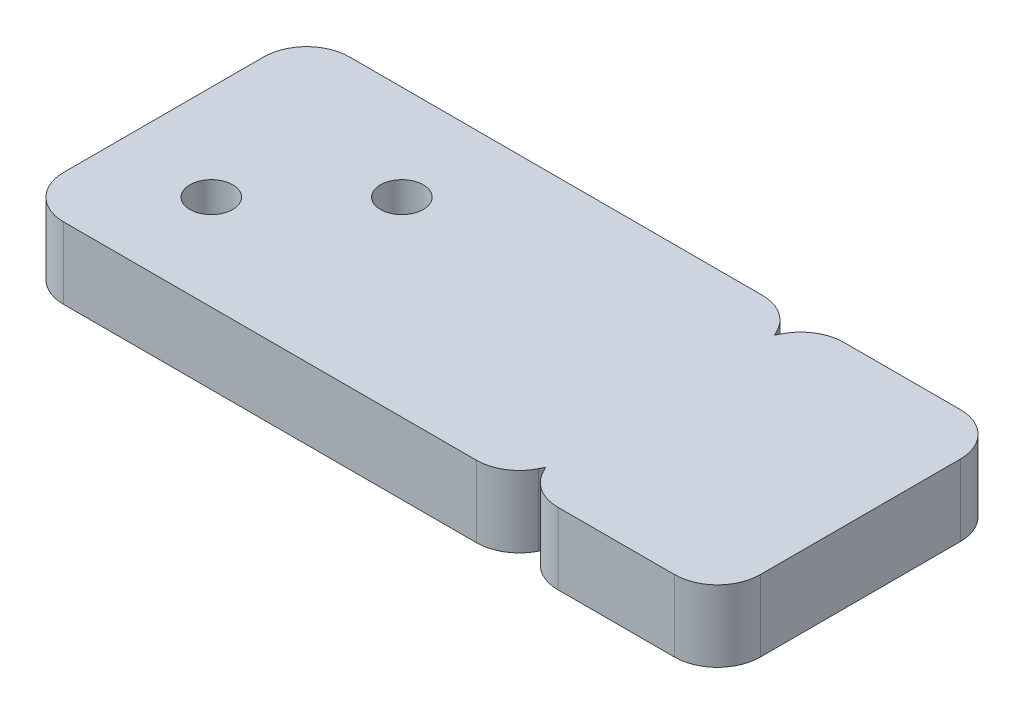
ISO-10303-21;
HEADER;
FILE_DESCRIPTION(('STEP AP214'),'2;1');
FILE_NAME('part.step','',(''),(''),'','','');
FILE_SCHEMA(('AUTOMOTIVE_DESIGN { 1 0 10303 214 1 1 1 1 }'));
ENDSEC;
DATA;
#1=APPLICATION_CONTEXT('core data for automotive mechanical design processes');
#2=APPLICATION_PROTOCOL_DEFINITION('international standard','automotive_design',2000,#1);
#3=PRODUCT_CONTEXT('',#1,'mechanical');
#4=PRODUCT('Part','Part','',(#3));
#5=PRODUCT_RELATED_PRODUCT_CATEGORY('part','',(#4));
#6=PRODUCT_DEFINITION_FORMATION('','',#4);
#7=PRODUCT_DEFINITION_CONTEXT('part definition',#1,'design');
#8=PRODUCT_DEFINITION('design','',#6,#7);
#9=PRODUCT_DEFINITION_SHAPE('','',#8);
#10=(LENGTH_UNIT() NAMED_UNIT(*) SI_UNIT(.MILLI.,.METRE.));
#11=(NAMED_UNIT(*) PLANE_ANGLE_UNIT() SI_UNIT($,.RADIAN.));
#12=(NAMED_UNIT(*) SI_UNIT($,.STERADIAN.) SOLID_ANGLE_UNIT());
#13=UNCERTAINTY_MEASURE_WITH_UNIT(LENGTH_MEASURE(1.E-05),#10,'distance_accuracy_value','');
#14=(GEOMETRIC_REPRESENTATION_CONTEXT(3) GLOBAL_UNCERTAINTY_ASSIGNED_CONTEXT((#13)) GLOBAL_UNIT_ASSIGNED_CONTEXT((#10,
#11,#12)) REPRESENTATION_CONTEXT('',''));
#15=CARTESIAN_POINT('',(0.,0.,0.));
#16=DIRECTION('',(0.,0.,1.));
#17=DIRECTION('',(1.,0.,0.));
#18=AXIS2_PLACEMENT_3D('',#15,#16,#17);
#19=CARTESIAN_POINT('',(0.,6.35,0.));
#20=DIRECTION('',(0.,1.,0.));
#21=DIRECTION('',(0.,0.,1.));
#22=AXIS2_PLACEMENT_3D('',#19,#20,#21);
#23=PLANE('',#22);
#24=CARTESIAN_POINT('',(-57.4218622627822,6.35,5.3393296669141));
#25=DIRECTION('',(0.,1.,0.));
#26=DIRECTION('',(0.,0.,1.));
#27=AXIS2_PLACEMENT_3D('',#24,#25,#26);
#28=CIRCLE('',#27,1.905);
#29=CARTESIAN_POINT('',(-57.4218622627822,6.35,7.2443296669141));
#30=VERTEX_POINT('',#29);
#31=EDGE_CURVE('E222',#30,#30,#28,.T.);
#32=ORIENTED_EDGE('',*,*,#31,.F.);
#33=EDGE_LOOP('',(#32));
#34=FACE_BOUND('',#33,.T.);
#35=DIRECTION('',(0.,0.,-1.));
#36=VECTOR('',#35,1.);
#37=CARTESIAN_POINT('',(-3.97525930955055,6.35,13.8052267136824));
#38=LINE('',#37,#36);
#39=CARTESIAN_POINT('',(-3.97525930955055,6.35,9.99522671368243));
#40=VERTEX_POINT('',#39);
#41=CARTESIAN_POINT('',(-3.97525930955055,6.35,-7.78477328631757));
#42=VERTEX_POINT('',#41);
#43=EDGE_CURVE('E202',#40,#42,#38,.T.);
#44=ORIENTED_EDGE('',*,*,#43,.T.);
#45=CARTESIAN_POINT('',(-7.78525930955055,6.35,-7.78477328631757));
#46=DIRECTION('',(0.,1.,0.));
#47=DIRECTION('',(0.,0.,1.));
#48=AXIS2_PLACEMENT_3D('',#45,#46,#47);
#49=CIRCLE('',#48,3.81);
#50=CARTESIAN_POINT('',(-7.78525930955055,6.35,-11.5947732863176));
#51=VERTEX_POINT('',#50);
#52=EDGE_CURVE('E313',#42,#51,#49,.T.);
#53=ORIENTED_EDGE('',*,*,#52,.T.);
#54=DIRECTION('',(-1.,0.,0.));
#55=VECTOR('',#54,1.);
#56=CARTESIAN_POINT('',(-3.97525930955055,6.35,-11.5947732863176));
#57=LINE('',#56,#55);
#58=CARTESIAN_POINT('',(-18.1432498124134,6.35,-11.5947732863176));
#59=VERTEX_POINT('',#58);
#60=EDGE_CURVE('E208',#51,#59,#57,.T.);
#61=ORIENTED_EDGE('',*,*,#60,.T.);
#62=CARTESIAN_POINT('',(-18.1432498124134,6.35,-7.78477328631757));
#63=DIRECTION('',(0.,1.,0.));
#64=DIRECTION('',(0.,0.,1.));
#65=AXIS2_PLACEMENT_3D('',#62,#63,#64);
#66=CIRCLE('',#65,3.81);
#67=CARTESIAN_POINT('',(-21.5510174101231,6.35,-9.48865708517241));
#68=VERTEX_POINT('',#67);
#69=EDGE_CURVE('E63',#59,#68,#66,.T.);
#70=ORIENTED_EDGE('',*,*,#69,.T.);
#71=DIRECTION('',(-0.447213595499958,0.,0.894427190999916));
#72=VECTOR('',#71,1.);
#73=CARTESIAN_POINT('',(-21.7679593095505,6.35,-9.05477328631757));
#74=LINE('',#73,#72);
#75=CARTESIAN_POINT('',(-21.7679593095505,6.35,-9.05477328631757));
#76=VERTEX_POINT('',#75);
#77=EDGE_CURVE('E211',#68,#76,#74,.T.);
#78=ORIENTED_EDGE('',*,*,#77,.T.);
#79=DIRECTION('',(-0.447213595499958,0.,-0.894427190999916));
#80=VECTOR('',#79,1.);
#81=CARTESIAN_POINT('',(-21.7679593095505,6.35,-9.05477328631757));
#82=LINE('',#81,#80);
#83=CARTESIAN_POINT('',(-21.984901208978,6.35,-9.48865708517241));
#84=VERTEX_POINT('',#83);
#85=EDGE_CURVE('E214',#76,#84,#82,.T.);
#86=ORIENTED_EDGE('',*,*,#85,.T.);
#87=CARTESIAN_POINT('',(-25.3926688066876,6.35,-7.78477328631757));
#88=DIRECTION('',(0.,1.,0.));
#89=DIRECTION('',(0.,0.,1.));
#90=AXIS2_PLACEMENT_3D('',#87,#88,#89);
#91=CIRCLE('',#90,3.81);
#92=CARTESIAN_POINT('',(-25.3926688066876,6.35,-11.5947732863176));
#93=VERTEX_POINT('',#92);
#94=EDGE_CURVE('E308',#84,#93,#91,.T.);
#95=ORIENTED_EDGE('',*,*,#94,.T.);
#96=DIRECTION('',(-1.,0.,0.));
#97=VECTOR('',#96,1.);
#98=CARTESIAN_POINT('',(-23.0379593095505,6.35,-11.5947732863176));
#99=LINE('',#98,#97);
#100=CARTESIAN_POINT('',(-62.0777593095505,6.35,-11.5947732863176));
#101=VERTEX_POINT('',#100);
#102=EDGE_CURVE('E253',#93,#101,#99,.T.);
#103=ORIENTED_EDGE('',*,*,#102,.T.);
#104=CARTESIAN_POINT('',(-62.0777593095505,6.35,-7.78477328631757));
#105=DIRECTION('',(0.,1.,0.));
#106=DIRECTION('',(0.,0.,1.));
#107=AXIS2_PLACEMENT_3D('',#104,#105,#106);
#108=CIRCLE('',#107,3.81);
#109=CARTESIAN_POINT('',(-65.8877593095505,6.35,-7.78477328631757));
#110=VERTEX_POINT('',#109);
#111=EDGE_CURVE('E305',#101,#110,#108,.T.);
#112=ORIENTED_EDGE('',*,*,#111,.T.);
#113=DIRECTION('',(0.,0.,1.));
#114=VECTOR('',#113,1.);
#115=CARTESIAN_POINT('',(-65.8877593095505,6.35,-11.5947732863176));
#116=LINE('',#115,#114);
#117=CARTESIAN_POINT('',(-65.8877593095505,6.35,9.99522671368243));
#118=VERTEX_POINT('',#117);
#119=EDGE_CURVE('E366',#110,#118,#116,.T.);
#120=ORIENTED_EDGE('',*,*,#119,.T.);
#121=CARTESIAN_POINT('',(-62.0777593095505,6.35,9.99522671368243));
#122=DIRECTION('',(0.,1.,0.));
#123=DIRECTION('',(0.,0.,1.));
#124=AXIS2_PLACEMENT_3D('',#121,#122,#123);
#125=CIRCLE('',#124,3.81);
#126=CARTESIAN_POINT('',(-62.0777593095505,6.35,13.8052267136824));
#127=VERTEX_POINT('',#126);
#128=EDGE_CURVE('E294',#118,#127,#125,.T.);
#129=ORIENTED_EDGE('',*,*,#128,.T.);
#130=DIRECTION('',(1.,0.,0.));
#131=VECTOR('',#130,1.);
#132=CARTESIAN_POINT('',(-65.8877593095505,6.35,13.8052267136824));
#133=LINE('',#132,#131);
#134=CARTESIAN_POINT('',(-25.3926688066876,6.35,13.8052267136824));
#135=VERTEX_POINT('',#134);
#136=EDGE_CURVE('E180',#127,#135,#133,.T.);
#137=ORIENTED_EDGE('',*,*,#136,.T.);
#138=CARTESIAN_POINT('',(-25.3926688066876,6.35,9.99522671368243));
#139=DIRECTION('',(0.,1.,0.));
#140=DIRECTION('',(0.,0.,1.));
#141=AXIS2_PLACEMENT_3D('',#138,#139,#140);
#142=CIRCLE('',#141,3.81);
#143=CARTESIAN_POINT('',(-21.984901208978,6.35,11.6991105125373));
#144=VERTEX_POINT('',#143);
#145=EDGE_CURVE('E175',#135,#144,#142,.T.);
#146=ORIENTED_EDGE('',*,*,#145,.T.);
#147=DIRECTION('',(0.447213595499958,0.,-0.894427190999916));
#148=VECTOR('',#147,1.);
#149=CARTESIAN_POINT('',(-21.7679593095505,6.35,11.2652267136824));
#150=LINE('',#149,#148);
#151=CARTESIAN_POINT('',(-21.7679593095505,6.35,11.2652267136824));
#152=VERTEX_POINT('',#151);
#153=EDGE_CURVE('E166',#144,#152,#150,.T.);
#154=ORIENTED_EDGE('',*,*,#153,.T.);
#155=DIRECTION('',(0.447213595499958,0.,0.894427190999916));
#156=VECTOR('',#155,1.);
#157=CARTESIAN_POINT('',(-21.7679593095505,6.35,11.2652267136824));
#158=LINE('',#157,#156);
#159=CARTESIAN_POINT('',(-21.5510174101231,6.35,11.6991105125373));
#160=VERTEX_POINT('',#159);
#161=EDGE_CURVE('E171',#152,#160,#158,.T.);
#162=ORIENTED_EDGE('',*,*,#161,.T.);
#163=CARTESIAN_POINT('',(-18.1432498124134,6.35,9.99522671368243));
#164=DIRECTION('',(0.,1.,0.));
#165=DIRECTION('',(0.,0.,1.));
#166=AXIS2_PLACEMENT_3D('',#163,#164,#165);
#167=CIRCLE('',#166,3.81);
#168=CARTESIAN_POINT('',(-18.1432498124134,6.35,13.8052267136824));
#169=VERTEX_POINT('',#168);
#170=EDGE_CURVE('E299',#160,#169,#167,.T.);
#171=ORIENTED_EDGE('',*,*,#170,.T.);
#172=DIRECTION('',(1.,0.,0.));
#173=VECTOR('',#172,1.);
#174=CARTESIAN_POINT('',(-20.4979593095505,6.35,13.8052267136824));
#175=LINE('',#174,#173);
#176=CARTESIAN_POINT('',(-7.78525930955055,6.35,13.8052267136824));
#177=VERTEX_POINT('',#176);
#178=EDGE_CURVE('E198',#169,#177,#175,.T.);
#179=ORIENTED_EDGE('',*,*,#178,.T.);
#180=CARTESIAN_POINT('',(-7.78525930955055,6.35,9.99522671368243));
#181=DIRECTION('',(0.,1.,0.));
#182=DIRECTION('',(0.,0.,1.));
#183=AXIS2_PLACEMENT_3D('',#180,#181,#182);
#184=CIRCLE('',#183,3.81);
#185=EDGE_CURVE('E302',#177,#40,#184,.T.);
#186=ORIENTED_EDGE('',*,*,#185,.T.);
#187=EDGE_LOOP('',(#44,#53,#61,#70,#78,#86,#95,#103,#112,#120,#129,#137,#146,#154,#162,#171,
#179,#186));
#188=FACE_BOUND('',#187,.T.);
#189=CARTESIAN_POINT('',(-48.9531474130117,6.35,-3.12938518285638));
#190=DIRECTION('',(0.,1.,0.));
#191=DIRECTION('',(0.,0.,1.));
#192=AXIS2_PLACEMENT_3D('',#189,#190,#191);
#193=CIRCLE('',#192,1.905);
#194=CARTESIAN_POINT('',(-48.9531474130117,6.35,-1.22438518285638));
#195=VERTEX_POINT('',#194);
#196=EDGE_CURVE('E377',#195,#195,#193,.T.);
#197=ORIENTED_EDGE('',*,*,#196,.F.);
#198=EDGE_LOOP('',(#197));
#199=FACE_BOUND('',#198,.T.);
#200=ADVANCED_FACE('F39',(#34,#188,#199),#23,.T.);
#201=CARTESIAN_POINT('',(0.,0.,0.));
#202=DIRECTION('',(0.,1.,0.));
#203=DIRECTION('',(0.,0.,1.));
#204=AXIS2_PLACEMENT_3D('',#201,#202,#203);
#205=PLANE('',#204);
#206=DIRECTION('',(-1.,0.,0.));
#207=VECTOR('',#206,1.);
#208=CARTESIAN_POINT('',(-3.97525930955055,0.,-11.5947732863176));
#209=LINE('',#208,#207);
#210=CARTESIAN_POINT('',(-7.78525930955055,0.,-11.5947732863176));
#211=VERTEX_POINT('',#210);
#212=CARTESIAN_POINT('',(-18.1432498124134,0.,-11.5947732863176));
#213=VERTEX_POINT('',#212);
#214=EDGE_CURVE('E243',#211,#213,#209,.T.);
#215=ORIENTED_EDGE('',*,*,#214,.F.);
#216=CARTESIAN_POINT('',(-7.78525930955055,0.,-7.78477328631757));
#217=DIRECTION('',(0.,1.,0.));
#218=DIRECTION('',(0.,0.,1.));
#219=AXIS2_PLACEMENT_3D('',#216,#217,#218);
#220=CIRCLE('',#219,3.81);
#221=CARTESIAN_POINT('',(-3.97525930955055,0.,-7.78477328631757));
#222=VERTEX_POINT('',#221);
#223=EDGE_CURVE('E284',#211,#222,#220,.F.);
#224=ORIENTED_EDGE('',*,*,#223,.T.);
#225=DIRECTION('',(0.,0.,-1.));
#226=VECTOR('',#225,1.);
#227=CARTESIAN_POINT('',(-3.97525930955055,0.,13.8052267136824));
#228=LINE('',#227,#226);
#229=CARTESIAN_POINT('',(-3.97525930955055,0.,9.99522671368243));
#230=VERTEX_POINT('',#229);
#231=EDGE_CURVE('E239',#230,#222,#228,.T.);
#232=ORIENTED_EDGE('',*,*,#231,.F.);
#233=CARTESIAN_POINT('',(-7.78525930955055,0.,9.99522671368243));
#234=DIRECTION('',(0.,1.,0.));
#235=DIRECTION('',(0.,0.,1.));
#236=AXIS2_PLACEMENT_3D('',#233,#234,#235);
#237=CIRCLE('',#236,3.81);
#238=CARTESIAN_POINT('',(-7.78525930955055,0.,13.8052267136824));
#239=VERTEX_POINT('',#238);
#240=EDGE_CURVE('E272',#230,#239,#237,.F.);
#241=ORIENTED_EDGE('',*,*,#240,.T.);
#242=DIRECTION('',(1.,0.,0.));
#243=VECTOR('',#242,1.);
#244=CARTESIAN_POINT('',(-20.4979593095505,0.,13.8052267136824));
#245=LINE('',#244,#243);
#246=CARTESIAN_POINT('',(-18.1432498124134,0.,13.8052267136824));
#247=VERTEX_POINT('',#246);
#248=EDGE_CURVE('E235',#247,#239,#245,.T.);
#249=ORIENTED_EDGE('',*,*,#248,.F.);
#250=CARTESIAN_POINT('',(-18.1432498124134,0.,9.99522671368243));
#251=DIRECTION('',(0.,1.,0.));
#252=DIRECTION('',(0.,0.,1.));
#253=AXIS2_PLACEMENT_3D('',#250,#251,#252);
#254=CIRCLE('',#253,3.81);
#255=CARTESIAN_POINT('',(-21.5510174101231,0.,11.6991105125373));
#256=VERTEX_POINT('',#255);
#257=EDGE_CURVE('E269',#247,#256,#254,.F.);
#258=ORIENTED_EDGE('',*,*,#257,.T.);
#259=DIRECTION('',(0.447213595499958,0.,0.894427190999916));
#260=VECTOR('',#259,1.);
#261=CARTESIAN_POINT('',(-21.7679593095505,0.,11.2652267136824));
#262=LINE('',#261,#260);
#263=CARTESIAN_POINT('',(-21.7679593095505,0.,11.2652267136824));
#264=VERTEX_POINT('',#263);
#265=EDGE_CURVE('E232',#264,#256,#262,.T.);
#266=ORIENTED_EDGE('',*,*,#265,.F.);
#267=DIRECTION('',(0.447213595499958,0.,-0.894427190999916));
#268=VECTOR('',#267,1.);
#269=CARTESIAN_POINT('',(-21.7679593095505,0.,11.2652267136824));
#270=LINE('',#269,#268);
#271=CARTESIAN_POINT('',(-21.984901208978,0.,11.6991105125373));
#272=VERTEX_POINT('',#271);
#273=EDGE_CURVE('E186',#272,#264,#270,.T.);
#274=ORIENTED_EDGE('',*,*,#273,.F.);
#275=CARTESIAN_POINT('',(-25.3926688066876,0.,9.99522671368243));
#276=DIRECTION('',(0.,1.,0.));
#277=DIRECTION('',(0.,0.,1.));
#278=AXIS2_PLACEMENT_3D('',#275,#276,#277);
#279=CIRCLE('',#278,3.81);
#280=CARTESIAN_POINT('',(-25.3926688066876,0.,13.8052267136824));
#281=VERTEX_POINT('',#280);
#282=EDGE_CURVE('E266',#272,#281,#279,.F.);
#283=ORIENTED_EDGE('',*,*,#282,.T.);
#284=DIRECTION('',(1.,0.,0.));
#285=VECTOR('',#284,1.);
#286=CARTESIAN_POINT('',(-65.8877593095505,0.,13.8052267136824));
#287=LINE('',#286,#285);
#288=CARTESIAN_POINT('',(-62.0777593095505,0.,13.8052267136824));
#289=VERTEX_POINT('',#288);
#290=EDGE_CURVE('E226',#289,#281,#287,.T.);
#291=ORIENTED_EDGE('',*,*,#290,.F.);
#292=CARTESIAN_POINT('',(-62.0777593095505,0.,9.99522671368243));
#293=DIRECTION('',(0.,1.,0.));
#294=DIRECTION('',(0.,0.,1.));
#295=AXIS2_PLACEMENT_3D('',#292,#293,#294);
#296=CIRCLE('',#295,3.81);
#297=CARTESIAN_POINT('',(-65.8877593095505,0.,9.99522671368243));
#298=VERTEX_POINT('',#297);
#299=EDGE_CURVE('E263',#289,#298,#296,.F.);
#300=ORIENTED_EDGE('',*,*,#299,.T.);
#301=DIRECTION('',(0.,0.,1.));
#302=VECTOR('',#301,1.);
#303=CARTESIAN_POINT('',(-65.8877593095505,0.,-11.5947732863176));
#304=LINE('',#303,#302);
#305=CARTESIAN_POINT('',(-65.8877593095505,0.,-7.78477328631757));
#306=VERTEX_POINT('',#305);
#307=EDGE_CURVE('E221',#306,#298,#304,.T.);
#308=ORIENTED_EDGE('',*,*,#307,.F.);
#309=CARTESIAN_POINT('',(-62.0777593095505,0.,-7.78477328631757));
#310=DIRECTION('',(0.,1.,0.));
#311=DIRECTION('',(0.,0.,1.));
#312=AXIS2_PLACEMENT_3D('',#309,#310,#311);
#313=CIRCLE('',#312,3.81);
#314=CARTESIAN_POINT('',(-62.0777593095505,0.,-11.5947732863176));
#315=VERTEX_POINT('',#314);
#316=EDGE_CURVE('E275',#306,#315,#313,.F.);
#317=ORIENTED_EDGE('',*,*,#316,.T.);
#318=DIRECTION('',(-1.,0.,0.));
#319=VECTOR('',#318,1.);
#320=CARTESIAN_POINT('',(-23.0379593095505,0.,-11.5947732863176));
#321=LINE('',#320,#319);
#322=CARTESIAN_POINT('',(-25.3926688066876,0.,-11.5947732863176));
#323=VERTEX_POINT('',#322);
#324=EDGE_CURVE('E217',#323,#315,#321,.T.);
#325=ORIENTED_EDGE('',*,*,#324,.F.);
#326=CARTESIAN_POINT('',(-25.3926688066876,0.,-7.78477328631757));
#327=DIRECTION('',(0.,1.,0.));
#328=DIRECTION('',(0.,0.,1.));
#329=AXIS2_PLACEMENT_3D('',#326,#327,#328);
#330=CIRCLE('',#329,3.81);
#331=CARTESIAN_POINT('',(-21.984901208978,0.,-9.48865708517241));
#332=VERTEX_POINT('',#331);
#333=EDGE_CURVE('E278',#323,#332,#330,.F.);
#334=ORIENTED_EDGE('',*,*,#333,.T.);
#335=DIRECTION('',(-0.447213595499958,0.,-0.894427190999916));
#336=VECTOR('',#335,1.);
#337=CARTESIAN_POINT('',(-21.7679593095505,0.,-9.05477328631757));
#338=LINE('',#337,#336);
#339=CARTESIAN_POINT('',(-21.7679593095505,0.,-9.05477328631757));
#340=VERTEX_POINT('',#339);
#341=EDGE_CURVE('E250',#340,#332,#338,.T.);
#342=ORIENTED_EDGE('',*,*,#341,.F.);
#343=DIRECTION('',(-0.447213595499958,0.,0.894427190999916));
#344=VECTOR('',#343,1.);
#345=CARTESIAN_POINT('',(-21.7679593095505,0.,-9.05477328631757));
#346=LINE('',#345,#344);
#347=CARTESIAN_POINT('',(-21.5510174101231,0.,-9.48865708517241));
#348=VERTEX_POINT('',#347);
#349=EDGE_CURVE('E247',#348,#340,#346,.T.);
#350=ORIENTED_EDGE('',*,*,#349,.F.);
#351=CARTESIAN_POINT('',(-18.1432498124134,0.,-7.78477328631757));
#352=DIRECTION('',(0.,1.,0.));
#353=DIRECTION('',(0.,0.,1.));
#354=AXIS2_PLACEMENT_3D('',#351,#352,#353);
#355=CIRCLE('',#354,3.81);
#356=EDGE_CURVE('E281',#348,#213,#355,.F.);
#357=ORIENTED_EDGE('',*,*,#356,.T.);
#358=EDGE_LOOP('',(#215,#224,#232,#241,#249,#258,#266,#274,#283,#291,#300,#308,#317,#325,#334,
#342,#350,#357));
#359=FACE_BOUND('',#358,.T.);
#360=CARTESIAN_POINT('',(-57.4218622627822,0.,5.3393296669141));
#361=DIRECTION('',(0.,1.,0.));
#362=DIRECTION('',(0.,0.,1.));
#363=AXIS2_PLACEMENT_3D('',#360,#361,#362);
#364=CIRCLE('',#363,1.905);
#365=CARTESIAN_POINT('',(-57.4218622627822,0.,7.2443296669141));
#366=VERTEX_POINT('',#365);
#367=EDGE_CURVE('E373',#366,#366,#364,.T.);
#368=ORIENTED_EDGE('',*,*,#367,.T.);
#369=EDGE_LOOP('',(#368));
#370=FACE_BOUND('',#369,.T.);
#371=CARTESIAN_POINT('',(-48.9531474130117,0.,-3.12938518285638));
#372=DIRECTION('',(0.,1.,0.));
#373=DIRECTION('',(0.,0.,1.));
#374=AXIS2_PLACEMENT_3D('',#371,#372,#373);
#375=CIRCLE('',#374,1.905);
#376=CARTESIAN_POINT('',(-48.9531474130117,0.,-1.22438518285638));
#377=VERTEX_POINT('',#376);
#378=EDGE_CURVE('E381',#377,#377,#375,.T.);
#379=ORIENTED_EDGE('',*,*,#378,.T.);
#380=EDGE_LOOP('',(#379));
#381=FACE_BOUND('',#380,.T.);
#382=ADVANCED_FACE('F359',(#359,#370,#381),#205,.F.);
#383=CARTESIAN_POINT('',(-23.0379593095505,6.35,-11.5947732863176));
#384=DIRECTION('',(0.,0.,1.));
#385=DIRECTION('',(1.,0.,0.));
#386=AXIS2_PLACEMENT_3D('',#383,#384,#385);
#387=PLANE('',#386);
#388=ORIENTED_EDGE('',*,*,#102,.F.);
#389=DIRECTION('',(0.,-1.,0.));
#390=VECTOR('',#389,1.);
#391=CARTESIAN_POINT('',(-25.3926688066876,6.35,-11.5947732863176));
#392=LINE('',#391,#390);
#393=EDGE_CURVE('E323',#93,#323,#392,.T.);
#394=ORIENTED_EDGE('',*,*,#393,.T.);
#395=ORIENTED_EDGE('',*,*,#324,.T.);
#396=DIRECTION('',(0.,-1.,0.));
#397=VECTOR('',#396,1.);
#398=CARTESIAN_POINT('',(-62.0777593095505,6.35,-11.5947732863176));
#399=LINE('',#398,#397);
#400=EDGE_CURVE('E320',#315,#101,#399,.F.);
#401=ORIENTED_EDGE('',*,*,#400,.T.);
#402=EDGE_LOOP('',(#388,#394,#395,#401));
#403=FACE_BOUND('',#402,.T.);
#404=ADVANCED_FACE('F397',(#403),#387,.F.);
#405=CARTESIAN_POINT('',(-65.8877593095505,6.35,-11.5947732863176));
#406=DIRECTION('',(1.,0.,0.));
#407=DIRECTION('',(0.,0.,-1.));
#408=AXIS2_PLACEMENT_3D('',#405,#406,#407);
#409=PLANE('',#408);
#410=ORIENTED_EDGE('',*,*,#119,.F.);
#411=DIRECTION('',(0.,-1.,0.));
#412=VECTOR('',#411,1.);
#413=CARTESIAN_POINT('',(-65.8877593095505,6.35,-7.78477328631757));
#414=LINE('',#413,#412);
#415=EDGE_CURVE('E332',#110,#306,#414,.T.);
#416=ORIENTED_EDGE('',*,*,#415,.T.);
#417=ORIENTED_EDGE('',*,*,#307,.T.);
#418=DIRECTION('',(0.,-1.,0.));
#419=VECTOR('',#418,1.);
#420=CARTESIAN_POINT('',(-65.8877593095505,6.35,9.99522671368243));
#421=LINE('',#420,#419);
#422=EDGE_CURVE('E329',#298,#118,#421,.F.);
#423=ORIENTED_EDGE('',*,*,#422,.T.);
#424=EDGE_LOOP('',(#410,#416,#417,#423));
#425=FACE_BOUND('',#424,.T.);
#426=ADVANCED_FACE('F429',(#425),#409,.F.);
#427=CARTESIAN_POINT('',(-65.8877593095505,6.35,13.8052267136824));
#428=DIRECTION('',(0.,0.,-1.));
#429=DIRECTION('',(-1.,0.,0.));
#430=AXIS2_PLACEMENT_3D('',#427,#428,#429);
#431=PLANE('',#430);
#432=ORIENTED_EDGE('',*,*,#290,.T.);
#433=DIRECTION('',(0.,-1.,0.));
#434=VECTOR('',#433,1.);
#435=CARTESIAN_POINT('',(-25.3926688066876,6.35,13.8052267136824));
#436=LINE('',#435,#434);
#437=EDGE_CURVE('E11',#281,#135,#436,.F.);
#438=ORIENTED_EDGE('',*,*,#437,.T.);
#439=ORIENTED_EDGE('',*,*,#136,.F.);
#440=DIRECTION('',(0.,-1.,0.));
#441=VECTOR('',#440,1.);
#442=CARTESIAN_POINT('',(-62.0777593095505,6.35,13.8052267136824));
#443=LINE('',#442,#441);
#444=EDGE_CURVE('E48',#127,#289,#443,.T.);
#445=ORIENTED_EDGE('',*,*,#444,.T.);
#446=EDGE_LOOP('',(#432,#438,#439,#445));
#447=FACE_BOUND('',#446,.T.);
#448=ADVANCED_FACE('F353',(#447),#431,.F.);
#449=CARTESIAN_POINT('',(-21.7679593095505,6.35,11.2652267136824));
#450=DIRECTION('',(-0.894427190999916,0.,-0.447213595499958));
#451=DIRECTION('',(-0.447213595499958,0.,0.894427190999916));
#452=AXIS2_PLACEMENT_3D('',#449,#450,#451);
#453=PLANE('',#452);
#454=ORIENTED_EDGE('',*,*,#153,.F.);
#455=DIRECTION('',(0.,-1.,0.));
#456=VECTOR('',#455,1.);
#457=CARTESIAN_POINT('',(-21.984901208978,6.35,11.6991105125373));
#458=LINE('',#457,#456);
#459=EDGE_CURVE('E345',#144,#272,#458,.T.);
#460=ORIENTED_EDGE('',*,*,#459,.T.);
#461=ORIENTED_EDGE('',*,*,#273,.T.);
#462=DIRECTION('',(0.,-1.,0.));
#463=VECTOR('',#462,1.);
#464=CARTESIAN_POINT('',(-21.7679593095505,6.35,11.2652267136824));
#465=LINE('',#464,#463);
#466=EDGE_CURVE('E183',#152,#264,#465,.T.);
#467=ORIENTED_EDGE('',*,*,#466,.F.);
#468=EDGE_LOOP('',(#454,#460,#461,#467));
#469=FACE_BOUND('',#468,.T.);
#470=ADVANCED_FACE('F184',(#469),#453,.F.);
#471=CARTESIAN_POINT('',(-21.7679593095505,6.35,11.2652267136824));
#472=DIRECTION('',(0.894427190999916,0.,-0.447213595499958));
#473=DIRECTION('',(-0.447213595499958,0.,-0.894427190999916));
#474=AXIS2_PLACEMENT_3D('',#471,#472,#473);
#475=PLANE('',#474);
#476=ORIENTED_EDGE('',*,*,#265,.T.);
#477=DIRECTION('',(0.,-1.,0.));
#478=VECTOR('',#477,1.);
#479=CARTESIAN_POINT('',(-21.5510174101231,6.35,11.6991105125373));
#480=LINE('',#479,#478);
#481=EDGE_CURVE('E196',#256,#160,#480,.F.);
#482=ORIENTED_EDGE('',*,*,#481,.T.);
#483=ORIENTED_EDGE('',*,*,#161,.F.);
#484=ORIENTED_EDGE('',*,*,#466,.T.);
#485=EDGE_LOOP('',(#476,#482,#483,#484));
#486=FACE_BOUND('',#485,.T.);
#487=ADVANCED_FACE('F194',(#486),#475,.F.);
#488=CARTESIAN_POINT('',(-20.4979593095505,6.35,13.8052267136824));
#489=DIRECTION('',(0.,0.,-1.));
#490=DIRECTION('',(-1.,0.,0.));
#491=AXIS2_PLACEMENT_3D('',#488,#489,#490);
#492=PLANE('',#491);
#493=ORIENTED_EDGE('',*,*,#248,.T.);
#494=DIRECTION('',(0.,-1.,0.));
#495=VECTOR('',#494,1.);
#496=CARTESIAN_POINT('',(-7.78525930955055,6.35,13.8052267136824));
#497=LINE('',#496,#495);
#498=EDGE_CURVE('E340',#239,#177,#497,.F.);
#499=ORIENTED_EDGE('',*,*,#498,.T.);
#500=ORIENTED_EDGE('',*,*,#178,.F.);
#501=DIRECTION('',(0.,-1.,0.));
#502=VECTOR('',#501,1.);
#503=CARTESIAN_POINT('',(-18.1432498124134,6.35,13.8052267136824));
#504=LINE('',#503,#502);
#505=EDGE_CURVE('E336',#169,#247,#504,.T.);
#506=ORIENTED_EDGE('',*,*,#505,.T.);
#507=EDGE_LOOP('',(#493,#499,#500,#506));
#508=FACE_BOUND('',#507,.T.);
#509=ADVANCED_FACE('F418',(#508),#492,.F.);
#510=CARTESIAN_POINT('',(-3.97525930955055,6.35,13.8052267136824));
#511=DIRECTION('',(-1.,0.,0.));
#512=DIRECTION('',(0.,0.,1.));
#513=AXIS2_PLACEMENT_3D('',#510,#511,#512);
#514=PLANE('',#513);
#515=ORIENTED_EDGE('',*,*,#231,.T.);
#516=DIRECTION('',(0.,-1.,0.));
#517=VECTOR('',#516,1.);
#518=CARTESIAN_POINT('',(-3.97525930955055,6.35,-7.78477328631757));
#519=LINE('',#518,#517);
#520=EDGE_CURVE('E291',#222,#42,#519,.F.);
#521=ORIENTED_EDGE('',*,*,#520,.T.);
#522=ORIENTED_EDGE('',*,*,#43,.F.);
#523=DIRECTION('',(0.,-1.,0.));
#524=VECTOR('',#523,1.);
#525=CARTESIAN_POINT('',(-3.97525930955055,6.35,9.99522671368243));
#526=LINE('',#525,#524);
#527=EDGE_CURVE('E287',#40,#230,#526,.T.);
#528=ORIENTED_EDGE('',*,*,#527,.T.);
#529=EDGE_LOOP('',(#515,#521,#522,#528));
#530=FACE_BOUND('',#529,.T.);
#531=ADVANCED_FACE('F414',(#530),#514,.F.);
#532=CARTESIAN_POINT('',(-3.97525930955055,6.35,-11.5947732863176));
#533=DIRECTION('',(0.,0.,1.));
#534=DIRECTION('',(1.,0.,0.));
#535=AXIS2_PLACEMENT_3D('',#532,#533,#534);
#536=PLANE('',#535);
#537=ORIENTED_EDGE('',*,*,#60,.F.);
#538=DIRECTION('',(0.,-1.,0.));
#539=VECTOR('',#538,1.);
#540=CARTESIAN_POINT('',(-7.78525930955055,6.35,-11.5947732863176));
#541=LINE('',#540,#539);
#542=EDGE_CURVE('E259',#51,#211,#541,.T.);
#543=ORIENTED_EDGE('',*,*,#542,.T.);
#544=ORIENTED_EDGE('',*,*,#214,.T.);
#545=DIRECTION('',(0.,-1.,0.));
#546=VECTOR('',#545,1.);
#547=CARTESIAN_POINT('',(-18.1432498124134,6.35,-11.5947732863176));
#548=LINE('',#547,#546);
#549=EDGE_CURVE('E191',#213,#59,#548,.F.);
#550=ORIENTED_EDGE('',*,*,#549,.T.);
#551=EDGE_LOOP('',(#537,#543,#544,#550));
#552=FACE_BOUND('',#551,.T.);
#553=ADVANCED_FACE('F410',(#552),#536,.F.);
#554=CARTESIAN_POINT('',(-21.7679593095505,6.35,-9.05477328631757));
#555=DIRECTION('',(0.894427190999916,0.,0.447213595499958));
#556=DIRECTION('',(0.447213595499958,0.,-0.894427190999916));
#557=AXIS2_PLACEMENT_3D('',#554,#555,#556);
#558=PLANE('',#557);
#559=ORIENTED_EDGE('',*,*,#77,.F.);
#560=DIRECTION('',(0.,-1.,0.));
#561=VECTOR('',#560,1.);
#562=CARTESIAN_POINT('',(-21.5510174101231,6.35,-9.48865708517241));
#563=LINE('',#562,#561);
#564=EDGE_CURVE('E316',#68,#348,#563,.T.);
#565=ORIENTED_EDGE('',*,*,#564,.T.);
#566=ORIENTED_EDGE('',*,*,#349,.T.);
#567=DIRECTION('',(0.,-1.,0.));
#568=VECTOR('',#567,1.);
#569=CARTESIAN_POINT('',(-21.7679593095505,6.35,-9.05477328631757));
#570=LINE('',#569,#568);
#571=EDGE_CURVE('E192',#76,#340,#570,.T.);
#572=ORIENTED_EDGE('',*,*,#571,.F.);
#573=EDGE_LOOP('',(#559,#565,#566,#572));
#574=FACE_BOUND('',#573,.T.);
#575=ADVANCED_FACE('F407',(#574),#558,.F.);
#576=CARTESIAN_POINT('',(-21.7679593095505,6.35,-9.05477328631757));
#577=DIRECTION('',(-0.894427190999916,0.,0.447213595499958));
#578=DIRECTION('',(0.447213595499958,0.,0.894427190999916));
#579=AXIS2_PLACEMENT_3D('',#576,#577,#578);
#580=PLANE('',#579);
#581=ORIENTED_EDGE('',*,*,#341,.T.);
#582=DIRECTION('',(0.,-1.,0.));
#583=VECTOR('',#582,1.);
#584=CARTESIAN_POINT('',(-21.984901208978,6.35,-9.48865708517241));
#585=LINE('',#584,#583);
#586=EDGE_CURVE('E55',#332,#84,#585,.F.);
#587=ORIENTED_EDGE('',*,*,#586,.T.);
#588=ORIENTED_EDGE('',*,*,#85,.F.);
#589=ORIENTED_EDGE('',*,*,#571,.T.);
#590=EDGE_LOOP('',(#581,#587,#588,#589));
#591=FACE_BOUND('',#590,.T.);
#592=ADVANCED_FACE('F404',(#591),#580,.F.);
#593=CARTESIAN_POINT('',(-57.4218622627822,6.35,5.3393296669141));
#594=DIRECTION('',(0.,-1.,0.));
#595=DIRECTION('',(0.,0.,-1.));
#596=AXIS2_PLACEMENT_3D('',#593,#594,#595);
#597=CYLINDRICAL_SURFACE('',#596,1.905);
#598=ORIENTED_EDGE('',*,*,#31,.T.);
#599=EDGE_LOOP('',(#598));
#600=FACE_BOUND('',#599,.T.);
#601=ORIENTED_EDGE('',*,*,#367,.F.);
#602=EDGE_LOOP('',(#601));
#603=FACE_BOUND('',#602,.T.);
#604=ADVANCED_FACE('F401',(#600,#603),#597,.F.);
#605=CARTESIAN_POINT('',(-48.9531474130117,6.35,-3.12938518285638));
#606=DIRECTION('',(0.,-1.,0.));
#607=DIRECTION('',(0.,0.,-1.));
#608=AXIS2_PLACEMENT_3D('',#605,#606,#607);
#609=CYLINDRICAL_SURFACE('',#608,1.905);
#610=ORIENTED_EDGE('',*,*,#196,.T.);
#611=EDGE_LOOP('',(#610));
#612=FACE_BOUND('',#611,.T.);
#613=ORIENTED_EDGE('',*,*,#378,.F.);
#614=EDGE_LOOP('',(#613));
#615=FACE_BOUND('',#614,.T.);
#616=ADVANCED_FACE('F389',(#612,#615),#609,.F.);
#617=CARTESIAN_POINT('',(-7.78525930955055,6.35,-7.78477328631757));
#618=DIRECTION('',(0.,-1.,0.));
#619=DIRECTION('',(0.,0.,-1.));
#620=AXIS2_PLACEMENT_3D('',#617,#618,#619);
#621=CYLINDRICAL_SURFACE('',#620,3.81);
#622=ORIENTED_EDGE('',*,*,#52,.F.);
#623=ORIENTED_EDGE('',*,*,#520,.F.);
#624=ORIENTED_EDGE('',*,*,#223,.F.);
#625=ORIENTED_EDGE('',*,*,#542,.F.);
#626=EDGE_LOOP('',(#622,#623,#624,#625));
#627=FACE_BOUND('',#626,.T.);
#628=ADVANCED_FACE('F436',(#627),#621,.T.);
#629=CARTESIAN_POINT('',(-18.1432498124134,6.35,-7.78477328631757));
#630=DIRECTION('',(0.,-1.,0.));
#631=DIRECTION('',(0.,0.,-1.));
#632=AXIS2_PLACEMENT_3D('',#629,#630,#631);
#633=CYLINDRICAL_SURFACE('',#632,3.81);
#634=ORIENTED_EDGE('',*,*,#69,.F.);
#635=ORIENTED_EDGE('',*,*,#549,.F.);
#636=ORIENTED_EDGE('',*,*,#356,.F.);
#637=ORIENTED_EDGE('',*,*,#564,.F.);
#638=EDGE_LOOP('',(#634,#635,#636,#637));
#639=FACE_BOUND('',#638,.T.);
#640=ADVANCED_FACE('F439',(#639),#633,.T.);
#641=CARTESIAN_POINT('',(-25.3926688066876,6.35,-7.78477328631757));
#642=DIRECTION('',(0.,-1.,0.));
#643=DIRECTION('',(0.,0.,-1.));
#644=AXIS2_PLACEMENT_3D('',#641,#642,#643);
#645=CYLINDRICAL_SURFACE('',#644,3.81);
#646=ORIENTED_EDGE('',*,*,#94,.F.);
#647=ORIENTED_EDGE('',*,*,#586,.F.);
#648=ORIENTED_EDGE('',*,*,#333,.F.);
#649=ORIENTED_EDGE('',*,*,#393,.F.);
#650=EDGE_LOOP('',(#646,#647,#648,#649));
#651=FACE_BOUND('',#650,.T.);
#652=ADVANCED_FACE('F443',(#651),#645,.T.);
#653=CARTESIAN_POINT('',(-62.0777593095505,6.35,-7.78477328631757));
#654=DIRECTION('',(0.,-1.,0.));
#655=DIRECTION('',(0.,0.,-1.));
#656=AXIS2_PLACEMENT_3D('',#653,#654,#655);
#657=CYLINDRICAL_SURFACE('',#656,3.81);
#658=ORIENTED_EDGE('',*,*,#111,.F.);
#659=ORIENTED_EDGE('',*,*,#400,.F.);
#660=ORIENTED_EDGE('',*,*,#316,.F.);
#661=ORIENTED_EDGE('',*,*,#415,.F.);
#662=EDGE_LOOP('',(#658,#659,#660,#661));
#663=FACE_BOUND('',#662,.T.);
#664=ADVANCED_FACE('F447',(#663),#657,.T.);
#665=CARTESIAN_POINT('',(-7.78525930955055,6.35,9.99522671368243));
#666=DIRECTION('',(0.,-1.,0.));
#667=DIRECTION('',(0.,0.,-1.));
#668=AXIS2_PLACEMENT_3D('',#665,#666,#667);
#669=CYLINDRICAL_SURFACE('',#668,3.81);
#670=ORIENTED_EDGE('',*,*,#185,.F.);
#671=ORIENTED_EDGE('',*,*,#498,.F.);
#672=ORIENTED_EDGE('',*,*,#240,.F.);
#673=ORIENTED_EDGE('',*,*,#527,.F.);
#674=EDGE_LOOP('',(#670,#671,#672,#673));
#675=FACE_BOUND('',#674,.T.);
#676=ADVANCED_FACE('F451',(#675),#669,.T.);
#677=CARTESIAN_POINT('',(-18.1432498124134,6.35,9.99522671368243));
#678=DIRECTION('',(0.,-1.,0.));
#679=DIRECTION('',(0.,0.,-1.));
#680=AXIS2_PLACEMENT_3D('',#677,#678,#679);
#681=CYLINDRICAL_SURFACE('',#680,3.81);
#682=ORIENTED_EDGE('',*,*,#170,.F.);
#683=ORIENTED_EDGE('',*,*,#481,.F.);
#684=ORIENTED_EDGE('',*,*,#257,.F.);
#685=ORIENTED_EDGE('',*,*,#505,.F.);
#686=EDGE_LOOP('',(#682,#683,#684,#685));
#687=FACE_BOUND('',#686,.T.);
#688=ADVANCED_FACE('F455',(#687),#681,.T.);
#689=CARTESIAN_POINT('',(-25.3926688066876,6.35,9.99522671368243));
#690=DIRECTION('',(0.,-1.,0.));
#691=DIRECTION('',(0.,0.,-1.));
#692=AXIS2_PLACEMENT_3D('',#689,#690,#691);
#693=CYLINDRICAL_SURFACE('',#692,3.81);
#694=ORIENTED_EDGE('',*,*,#145,.F.);
#695=ORIENTED_EDGE('',*,*,#437,.F.);
#696=ORIENTED_EDGE('',*,*,#282,.F.);
#697=ORIENTED_EDGE('',*,*,#459,.F.);
#698=EDGE_LOOP('',(#694,#695,#696,#697));
#699=FACE_BOUND('',#698,.T.);
#700=ADVANCED_FACE('F363',(#699),#693,.T.);
#701=CARTESIAN_POINT('',(-62.0777593095505,6.35,9.99522671368243));
#702=DIRECTION('',(0.,-1.,0.));
#703=DIRECTION('',(0.,0.,-1.));
#704=AXIS2_PLACEMENT_3D('',#701,#702,#703);
#705=CYLINDRICAL_SURFACE('',#704,3.81);
#706=ORIENTED_EDGE('',*,*,#128,.F.);
#707=ORIENTED_EDGE('',*,*,#422,.F.);
#708=ORIENTED_EDGE('',*,*,#299,.F.);
#709=ORIENTED_EDGE('',*,*,#444,.F.);
#710=EDGE_LOOP('',(#706,#707,#708,#709));
#711=FACE_BOUND('',#710,.T.);
#712=ADVANCED_FACE('F41',(#711),#705,.T.);
#713=CLOSED_SHELL('',(#200,#382,#404,#426,#448,#470,#487,#509,#531,#553,#575,#592,#604,#616,
#628,#640,#652,#664,#676,#688,#700,#712));
#714=MANIFOLD_SOLID_BREP('B2',#713);
#715=ADVANCED_BREP_SHAPE_REPRESENTATION('',(#18,#714),#14);
#716=SHAPE_DEFINITION_REPRESENTATION(#9,#715);
ENDSEC;
END-ISO-10303-21;
